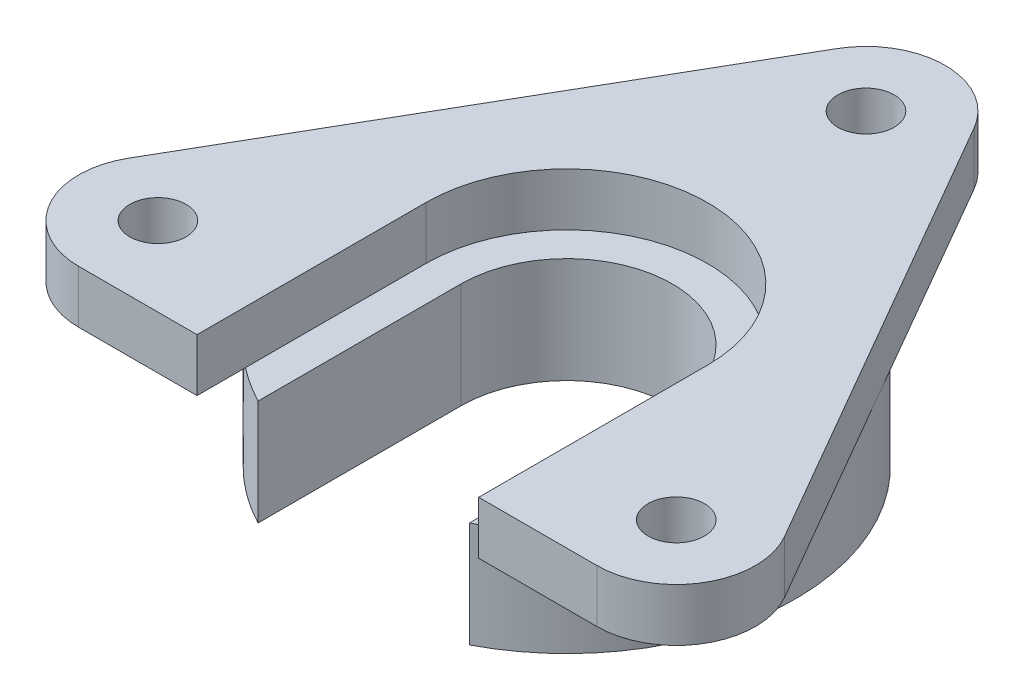
ISO-10303-21;
HEADER;
FILE_DESCRIPTION(('STEP AP214'),'2;1');
FILE_NAME('part.step','',(''),(''),'','','');
FILE_SCHEMA(('AUTOMOTIVE_DESIGN { 1 0 10303 214 1 1 1 1 }'));
ENDSEC;
DATA;
#1=APPLICATION_CONTEXT('core data for automotive mechanical design processes');
#2=APPLICATION_PROTOCOL_DEFINITION('international standard','automotive_design',2000,#1);
#3=PRODUCT_CONTEXT('',#1,'mechanical');
#4=PRODUCT('Part','Part','',(#3));
#5=PRODUCT_RELATED_PRODUCT_CATEGORY('part','',(#4));
#6=PRODUCT_DEFINITION_FORMATION('','',#4);
#7=PRODUCT_DEFINITION_CONTEXT('part definition',#1,'design');
#8=PRODUCT_DEFINITION('design','',#6,#7);
#9=PRODUCT_DEFINITION_SHAPE('','',#8);
#10=(LENGTH_UNIT() NAMED_UNIT(*) SI_UNIT(.MILLI.,.METRE.));
#11=(NAMED_UNIT(*) PLANE_ANGLE_UNIT() SI_UNIT($,.RADIAN.));
#12=(NAMED_UNIT(*) SI_UNIT($,.STERADIAN.) SOLID_ANGLE_UNIT());
#13=UNCERTAINTY_MEASURE_WITH_UNIT(LENGTH_MEASURE(1.E-05),#10,'distance_accuracy_value','');
#14=(GEOMETRIC_REPRESENTATION_CONTEXT(3) GLOBAL_UNCERTAINTY_ASSIGNED_CONTEXT((#13)) GLOBAL_UNIT_ASSIGNED_CONTEXT((#10,
#11,#12)) REPRESENTATION_CONTEXT('',''));
#15=CARTESIAN_POINT('',(0.,0.,0.));
#16=DIRECTION('',(0.,0.,1.));
#17=DIRECTION('',(1.,0.,0.));
#18=AXIS2_PLACEMENT_3D('',#15,#16,#17);
#19=CARTESIAN_POINT('',(0.,-30.,0.));
#20=DIRECTION('',(0.,1.,0.));
#21=DIRECTION('',(0.,0.,1.));
#22=AXIS2_PLACEMENT_3D('',#19,#20,#21);
#23=PLANE('',#22);
#24=DIRECTION('',(0.,0.,-1.));
#25=VECTOR('',#24,1.);
#26=CARTESIAN_POINT('',(8.,-30.,13.));
#27=LINE('',#26,#25);
#28=CARTESIAN_POINT('',(8.,-30.,10.2469507659596));
#29=VERTEX_POINT('',#28);
#30=CARTESIAN_POINT('',(8.,-30.,0.));
#31=VERTEX_POINT('',#30);
#32=EDGE_CURVE('E260',#29,#31,#27,.T.);
#33=ORIENTED_EDGE('',*,*,#32,.T.);
#34=CARTESIAN_POINT('',(0.,-30.,0.));
#35=DIRECTION('',(0.,1.,0.));
#36=DIRECTION('',(0.,0.,1.));
#37=AXIS2_PLACEMENT_3D('',#34,#35,#36);
#38=CIRCLE('',#37,8.);
#39=CARTESIAN_POINT('',(-8.,-30.,0.));
#40=VERTEX_POINT('',#39);
#41=EDGE_CURVE('E277',#31,#40,#38,.T.);
#42=ORIENTED_EDGE('',*,*,#41,.T.);
#43=DIRECTION('',(0.,0.,-1.));
#44=VECTOR('',#43,1.);
#45=CARTESIAN_POINT('',(-8.,-30.,13.));
#46=LINE('',#45,#44);
#47=CARTESIAN_POINT('',(-8.,-30.,10.2469507659596));
#48=VERTEX_POINT('',#47);
#49=EDGE_CURVE('E54',#48,#40,#46,.T.);
#50=ORIENTED_EDGE('',*,*,#49,.F.);
#51=CARTESIAN_POINT('',(0.,-30.,0.));
#52=DIRECTION('',(0.,1.,0.));
#53=DIRECTION('',(0.,0.,1.));
#54=AXIS2_PLACEMENT_3D('',#51,#52,#53);
#55=CIRCLE('',#54,13.);
#56=CARTESIAN_POINT('',(-6.,-30.,11.5325625946708));
#57=VERTEX_POINT('',#56);
#58=EDGE_CURVE('E245',#57,#48,#55,.F.);
#59=ORIENTED_EDGE('',*,*,#58,.F.);
#60=DIRECTION('',(0.,0.,-1.));
#61=VECTOR('',#60,1.);
#62=CARTESIAN_POINT('',(-6.,-30.,13.));
#63=LINE('',#62,#61);
#64=CARTESIAN_POINT('',(-6.,-30.,0.));
#65=VERTEX_POINT('',#64);
#66=EDGE_CURVE('E243',#57,#65,#63,.T.);
#67=ORIENTED_EDGE('',*,*,#66,.T.);
#68=CARTESIAN_POINT('',(0.,-30.,0.));
#69=DIRECTION('',(0.,1.,0.));
#70=DIRECTION('',(0.,0.,1.));
#71=AXIS2_PLACEMENT_3D('',#68,#69,#70);
#72=CIRCLE('',#71,6.);
#73=CARTESIAN_POINT('',(6.,-30.,0.));
#74=VERTEX_POINT('',#73);
#75=EDGE_CURVE('E224',#74,#65,#72,.T.);
#76=ORIENTED_EDGE('',*,*,#75,.F.);
#77=DIRECTION('',(0.,0.,-1.));
#78=VECTOR('',#77,1.);
#79=CARTESIAN_POINT('',(6.,-30.,13.));
#80=LINE('',#79,#78);
#81=CARTESIAN_POINT('',(6.,-30.,11.5325625946708));
#82=VERTEX_POINT('',#81);
#83=EDGE_CURVE('E240',#82,#74,#80,.T.);
#84=ORIENTED_EDGE('',*,*,#83,.F.);
#85=CARTESIAN_POINT('',(0.,-30.,0.));
#86=DIRECTION('',(0.,1.,0.));
#87=DIRECTION('',(0.,0.,1.));
#88=AXIS2_PLACEMENT_3D('',#85,#86,#87);
#89=CIRCLE('',#88,13.);
#90=EDGE_CURVE('E161',#29,#82,#89,.F.);
#91=ORIENTED_EDGE('',*,*,#90,.F.);
#92=EDGE_LOOP('',(#33,#42,#50,#59,#67,#76,#84,#91));
#93=FACE_BOUND('',#92,.T.);
#94=ADVANCED_FACE('F39',(#93),#23,.T.);
#95=CARTESIAN_POINT('',(0.,-36.,0.));
#96=DIRECTION('',(0.,1.,0.));
#97=DIRECTION('',(0.,0.,1.));
#98=AXIS2_PLACEMENT_3D('',#95,#96,#97);
#99=CYLINDRICAL_SURFACE('',#98,13.);
#100=CARTESIAN_POINT('',(0.,-36.,0.));
#101=DIRECTION('',(0.,1.,0.));
#102=DIRECTION('',(0.,0.,1.));
#103=AXIS2_PLACEMENT_3D('',#100,#101,#102);
#104=CIRCLE('',#103,13.);
#105=CARTESIAN_POINT('',(6.,-36.,11.5325625946708));
#106=VERTEX_POINT('',#105);
#107=CARTESIAN_POINT('',(-6.,-36.,11.5325625946708));
#108=VERTEX_POINT('',#107);
#109=EDGE_CURVE('E11',#106,#108,#104,.T.);
#110=ORIENTED_EDGE('',*,*,#109,.T.);
#111=DIRECTION('',(0.,1.,0.));
#112=VECTOR('',#111,1.);
#113=CARTESIAN_POINT('',(-6.,-36.,11.5325625946708));
#114=LINE('',#113,#112);
#115=EDGE_CURVE('E270',#108,#57,#114,.T.);
#116=ORIENTED_EDGE('',*,*,#115,.T.);
#117=ORIENTED_EDGE('',*,*,#58,.T.);
#118=CARTESIAN_POINT('',(0.,-30.,0.));
#119=DIRECTION('',(0.,1.,0.));
#120=DIRECTION('',(0.,0.,1.));
#121=AXIS2_PLACEMENT_3D('',#118,#119,#120);
#122=CIRCLE('',#121,13.);
#123=CARTESIAN_POINT('',(-11.2583302491977,-30.,-6.5));
#124=VERTEX_POINT('',#123);
#125=EDGE_CURVE('E228',#124,#48,#122,.T.);
#126=ORIENTED_EDGE('',*,*,#125,.F.);
#127=CARTESIAN_POINT('',(11.2583302491977,-30.,-6.5));
#128=VERTEX_POINT('',#127);
#129=EDGE_CURVE('E557',#128,#124,#122,.T.);
#130=ORIENTED_EDGE('',*,*,#129,.F.);
#131=EDGE_CURVE('E43',#29,#128,#122,.T.);
#132=ORIENTED_EDGE('',*,*,#131,.F.);
#133=ORIENTED_EDGE('',*,*,#90,.T.);
#134=DIRECTION('',(0.,1.,0.));
#135=VECTOR('',#134,1.);
#136=CARTESIAN_POINT('',(6.,-36.,11.5325625946708));
#137=LINE('',#136,#135);
#138=EDGE_CURVE('E274',#82,#106,#137,.F.);
#139=ORIENTED_EDGE('',*,*,#138,.T.);
#140=EDGE_LOOP('',(#110,#116,#117,#126,#130,#132,#133,#139));
#141=FACE_BOUND('',#140,.T.);
#142=ADVANCED_FACE('F41',(#141),#99,.T.);
#143=CARTESIAN_POINT('',(0.,-36.,0.));
#144=DIRECTION('',(0.,1.,0.));
#145=DIRECTION('',(0.,0.,1.));
#146=AXIS2_PLACEMENT_3D('',#143,#144,#145);
#147=PLANE('',#146);
#148=DIRECTION('',(0.,0.,-1.));
#149=VECTOR('',#148,1.);
#150=CARTESIAN_POINT('',(-6.,-36.,0.));
#151=LINE('',#150,#149);
#152=CARTESIAN_POINT('',(-6.,-36.,0.));
#153=VERTEX_POINT('',#152);
#154=EDGE_CURVE('E251',#108,#153,#151,.T.);
#155=ORIENTED_EDGE('',*,*,#154,.F.);
#156=ORIENTED_EDGE('',*,*,#109,.F.);
#157=DIRECTION('',(0.,0.,1.));
#158=VECTOR('',#157,1.);
#159=CARTESIAN_POINT('',(6.,-36.,0.));
#160=LINE('',#159,#158);
#161=CARTESIAN_POINT('',(6.,-36.,0.));
#162=VERTEX_POINT('',#161);
#163=EDGE_CURVE('E272',#162,#106,#160,.T.);
#164=ORIENTED_EDGE('',*,*,#163,.F.);
#165=CARTESIAN_POINT('',(0.,-36.,0.));
#166=DIRECTION('',(0.,1.,0.));
#167=DIRECTION('',(0.,0.,1.));
#168=AXIS2_PLACEMENT_3D('',#165,#166,#167);
#169=CIRCLE('',#168,6.);
#170=EDGE_CURVE('E225',#162,#153,#169,.T.);
#171=ORIENTED_EDGE('',*,*,#170,.T.);
#172=EDGE_LOOP('',(#155,#156,#164,#171));
#173=FACE_BOUND('',#172,.T.);
#174=ADVANCED_FACE('F300',(#173),#147,.F.);
#175=CARTESIAN_POINT('',(0.,-36.,0.));
#176=DIRECTION('',(0.,1.,0.));
#177=DIRECTION('',(0.,0.,1.));
#178=AXIS2_PLACEMENT_3D('',#175,#176,#177);
#179=CYLINDRICAL_SURFACE('',#178,6.);
#180=DIRECTION('',(0.,1.,0.));
#181=VECTOR('',#180,1.);
#182=CARTESIAN_POINT('',(6.,-36.2763210858077,0.));
#183=LINE('',#182,#181);
#184=EDGE_CURVE('E238',#162,#74,#183,.T.);
#185=ORIENTED_EDGE('',*,*,#184,.T.);
#186=ORIENTED_EDGE('',*,*,#75,.T.);
#187=DIRECTION('',(0.,-1.,0.));
#188=VECTOR('',#187,1.);
#189=CARTESIAN_POINT('',(-6.,-30.,0.));
#190=LINE('',#189,#188);
#191=EDGE_CURVE('E237',#65,#153,#190,.T.);
#192=ORIENTED_EDGE('',*,*,#191,.T.);
#193=ORIENTED_EDGE('',*,*,#170,.F.);
#194=EDGE_LOOP('',(#185,#186,#192,#193));
#195=FACE_BOUND('',#194,.T.);
#196=ADVANCED_FACE('F234',(#195),#179,.F.);
#197=CARTESIAN_POINT('',(0.,-30.,-17.));
#198=DIRECTION('',(0.,1.,0.));
#199=DIRECTION('',(0.,0.,1.));
#200=AXIS2_PLACEMENT_3D('',#197,#198,#199);
#201=PLANE('',#200);
#202=CARTESIAN_POINT('',(14.7224318643355,-30.,8.5));
#203=DIRECTION('',(0.,1.,0.));
#204=DIRECTION('',(0.,0.,1.));
#205=AXIS2_PLACEMENT_3D('',#202,#203,#204);
#206=CIRCLE('',#205,1.6);
#207=CARTESIAN_POINT('',(14.7224318643355,-30.,10.1));
#208=VERTEX_POINT('',#207);
#209=EDGE_CURVE('E386',#208,#208,#206,.T.);
#210=ORIENTED_EDGE('',*,*,#209,.T.);
#211=EDGE_LOOP('',(#210));
#212=FACE_BOUND('',#211,.T.);
#213=CARTESIAN_POINT('',(8.,-30.,13.));
#214=VERTEX_POINT('',#213);
#215=EDGE_CURVE('E261',#214,#29,#27,.T.);
#216=ORIENTED_EDGE('',*,*,#215,.T.);
#217=ORIENTED_EDGE('',*,*,#131,.T.);
#218=DIRECTION('',(-0.5,0.,-0.866025403784438));
#219=VECTOR('',#218,1.);
#220=CARTESIAN_POINT('',(18.6195461813654,-30.,6.25));
#221=LINE('',#220,#219);
#222=CARTESIAN_POINT('',(18.6195461813654,-30.,6.25));
#223=VERTEX_POINT('',#222);
#224=EDGE_CURVE('E204',#223,#128,#221,.T.);
#225=ORIENTED_EDGE('',*,*,#224,.F.);
#226=CARTESIAN_POINT('',(14.7224318643355,-30.,8.5));
#227=DIRECTION('',(0.,1.,0.));
#228=DIRECTION('',(0.,0.,1.));
#229=AXIS2_PLACEMENT_3D('',#226,#227,#228);
#230=CIRCLE('',#229,4.5);
#231=CARTESIAN_POINT('',(14.7224318643355,-30.,13.));
#232=VERTEX_POINT('',#231);
#233=EDGE_CURVE('E201',#232,#223,#230,.T.);
#234=ORIENTED_EDGE('',*,*,#233,.F.);
#235=DIRECTION('',(1.,0.,0.));
#236=VECTOR('',#235,1.);
#237=CARTESIAN_POINT('',(-14.7224318643354,-30.,13.));
#238=LINE('',#237,#236);
#239=EDGE_CURVE('E199',#214,#232,#238,.T.);
#240=ORIENTED_EDGE('',*,*,#239,.F.);
#241=EDGE_LOOP('',(#216,#217,#225,#234,#240));
#242=FACE_BOUND('',#241,.T.);
#243=ADVANCED_FACE('F311',(#212,#242),#201,.F.);
#244=CARTESIAN_POINT('',(-14.7224318643354,-30.,8.5));
#245=DIRECTION('',(0.,1.,0.));
#246=DIRECTION('',(0.,0.,1.));
#247=AXIS2_PLACEMENT_3D('',#244,#245,#246);
#248=CIRCLE('',#247,1.6);
#249=CARTESIAN_POINT('',(-14.7224318643354,-30.,10.1));
#250=VERTEX_POINT('',#249);
#251=EDGE_CURVE('E380',#250,#250,#248,.T.);
#252=ORIENTED_EDGE('',*,*,#251,.T.);
#253=EDGE_LOOP('',(#252));
#254=FACE_BOUND('',#253,.T.);
#255=CARTESIAN_POINT('',(-8.,-30.,13.));
#256=VERTEX_POINT('',#255);
#257=EDGE_CURVE('E162',#256,#48,#46,.T.);
#258=ORIENTED_EDGE('',*,*,#257,.F.);
#259=CARTESIAN_POINT('',(-14.7224318643354,-30.,13.));
#260=VERTEX_POINT('',#259);
#261=EDGE_CURVE('E171',#260,#256,#238,.T.);
#262=ORIENTED_EDGE('',*,*,#261,.F.);
#263=CARTESIAN_POINT('',(-14.7224318643354,-30.,8.5));
#264=DIRECTION('',(0.,1.,0.));
#265=DIRECTION('',(0.,0.,1.));
#266=AXIS2_PLACEMENT_3D('',#263,#264,#265);
#267=CIRCLE('',#266,4.50000000000001);
#268=CARTESIAN_POINT('',(-18.6195461813654,-30.,6.24999999999999));
#269=VERTEX_POINT('',#268);
#270=EDGE_CURVE('E197',#269,#260,#267,.T.);
#271=ORIENTED_EDGE('',*,*,#270,.F.);
#272=DIRECTION('',(-0.5,0.,0.866025403784438));
#273=VECTOR('',#272,1.);
#274=CARTESIAN_POINT('',(-3.89711431702998,-30.,-19.25));
#275=LINE('',#274,#273);
#276=EDGE_CURVE('E192',#124,#269,#275,.T.);
#277=ORIENTED_EDGE('',*,*,#276,.F.);
#278=ORIENTED_EDGE('',*,*,#125,.T.);
#279=EDGE_LOOP('',(#258,#262,#271,#277,#278));
#280=FACE_BOUND('',#279,.T.);
#281=ADVANCED_FACE('F293',(#254,#280),#201,.F.);
#282=CARTESIAN_POINT('',(0.,-27.,-17.));
#283=DIRECTION('',(0.,1.,0.));
#284=DIRECTION('',(0.,0.,1.));
#285=AXIS2_PLACEMENT_3D('',#282,#283,#284);
#286=PLANE('',#285);
#287=CARTESIAN_POINT('',(0.,-27.,-17.));
#288=DIRECTION('',(0.,1.,0.));
#289=DIRECTION('',(0.,0.,1.));
#290=AXIS2_PLACEMENT_3D('',#287,#288,#289);
#291=CIRCLE('',#290,1.6);
#292=CARTESIAN_POINT('',(0.,-27.,-15.4));
#293=VERTEX_POINT('',#292);
#294=EDGE_CURVE('E372',#293,#293,#291,.T.);
#295=ORIENTED_EDGE('',*,*,#294,.F.);
#296=EDGE_LOOP('',(#295));
#297=FACE_BOUND('',#296,.T.);
#298=CARTESIAN_POINT('',(14.7224318643355,-27.,8.5));
#299=DIRECTION('',(0.,1.,0.));
#300=DIRECTION('',(0.,0.,1.));
#301=AXIS2_PLACEMENT_3D('',#298,#299,#300);
#302=CIRCLE('',#301,1.6);
#303=CARTESIAN_POINT('',(14.7224318643355,-27.,10.1));
#304=VERTEX_POINT('',#303);
#305=EDGE_CURVE('E376',#304,#304,#302,.T.);
#306=ORIENTED_EDGE('',*,*,#305,.F.);
#307=EDGE_LOOP('',(#306));
#308=FACE_BOUND('',#307,.T.);
#309=CARTESIAN_POINT('',(-14.7224318643354,-27.,8.5));
#310=DIRECTION('',(0.,1.,0.));
#311=DIRECTION('',(0.,0.,1.));
#312=AXIS2_PLACEMENT_3D('',#309,#310,#311);
#313=CIRCLE('',#312,1.6);
#314=CARTESIAN_POINT('',(-14.7224318643354,-27.,10.1));
#315=VERTEX_POINT('',#314);
#316=EDGE_CURVE('E254',#315,#315,#313,.T.);
#317=ORIENTED_EDGE('',*,*,#316,.F.);
#318=EDGE_LOOP('',(#317));
#319=FACE_BOUND('',#318,.T.);
#320=DIRECTION('',(1.,0.,0.));
#321=VECTOR('',#320,1.);
#322=CARTESIAN_POINT('',(-14.7224318643354,-27.,13.));
#323=LINE('',#322,#321);
#324=CARTESIAN_POINT('',(-14.7224318643354,-27.,13.));
#325=VERTEX_POINT('',#324);
#326=CARTESIAN_POINT('',(-8.,-27.,13.));
#327=VERTEX_POINT('',#326);
#328=EDGE_CURVE('E169',#325,#327,#323,.T.);
#329=ORIENTED_EDGE('',*,*,#328,.T.);
#330=DIRECTION('',(0.,0.,-1.));
#331=VECTOR('',#330,1.);
#332=CARTESIAN_POINT('',(-8.,-27.,13.));
#333=LINE('',#332,#331);
#334=CARTESIAN_POINT('',(-8.,-27.,0.));
#335=VERTEX_POINT('',#334);
#336=EDGE_CURVE('E151',#327,#335,#333,.T.);
#337=ORIENTED_EDGE('',*,*,#336,.T.);
#338=CARTESIAN_POINT('',(0.,-27.,0.));
#339=DIRECTION('',(0.,1.,0.));
#340=DIRECTION('',(0.,0.,1.));
#341=AXIS2_PLACEMENT_3D('',#338,#339,#340);
#342=CIRCLE('',#341,8.);
#343=CARTESIAN_POINT('',(8.,-27.,0.));
#344=VERTEX_POINT('',#343);
#345=EDGE_CURVE('E193',#344,#335,#342,.T.);
#346=ORIENTED_EDGE('',*,*,#345,.F.);
#347=DIRECTION('',(0.,0.,-1.));
#348=VECTOR('',#347,1.);
#349=CARTESIAN_POINT('',(8.,-27.,13.));
#350=LINE('',#349,#348);
#351=CARTESIAN_POINT('',(8.,-27.,13.));
#352=VERTEX_POINT('',#351);
#353=EDGE_CURVE('E62',#352,#344,#350,.T.);
#354=ORIENTED_EDGE('',*,*,#353,.F.);
#355=CARTESIAN_POINT('',(14.7224318643355,-27.,13.));
#356=VERTEX_POINT('',#355);
#357=EDGE_CURVE('E180',#352,#356,#323,.T.);
#358=ORIENTED_EDGE('',*,*,#357,.T.);
#359=CARTESIAN_POINT('',(14.7224318643355,-27.,8.5));
#360=DIRECTION('',(0.,1.,0.));
#361=DIRECTION('',(0.,0.,1.));
#362=AXIS2_PLACEMENT_3D('',#359,#360,#361);
#363=CIRCLE('',#362,4.5);
#364=CARTESIAN_POINT('',(18.6195461813654,-27.,6.25));
#365=VERTEX_POINT('',#364);
#366=EDGE_CURVE('E179',#356,#365,#363,.T.);
#367=ORIENTED_EDGE('',*,*,#366,.T.);
#368=DIRECTION('',(-0.5,0.,-0.866025403784438));
#369=VECTOR('',#368,1.);
#370=CARTESIAN_POINT('',(18.6195461813654,-27.,6.25));
#371=LINE('',#370,#369);
#372=CARTESIAN_POINT('',(3.89711431702997,-27.,-19.25));
#373=VERTEX_POINT('',#372);
#374=EDGE_CURVE('E182',#365,#373,#371,.T.);
#375=ORIENTED_EDGE('',*,*,#374,.T.);
#376=CARTESIAN_POINT('',(0.,-27.,-17.));
#377=DIRECTION('',(0.,1.,0.));
#378=DIRECTION('',(0.,0.,1.));
#379=AXIS2_PLACEMENT_3D('',#376,#377,#378);
#380=CIRCLE('',#379,4.5);
#381=CARTESIAN_POINT('',(-3.89711431702998,-27.,-19.25));
#382=VERTEX_POINT('',#381);
#383=EDGE_CURVE('E207',#373,#382,#380,.T.);
#384=ORIENTED_EDGE('',*,*,#383,.T.);
#385=DIRECTION('',(-0.5,0.,0.866025403784438));
#386=VECTOR('',#385,1.);
#387=CARTESIAN_POINT('',(-3.89711431702998,-27.,-19.25));
#388=LINE('',#387,#386);
#389=CARTESIAN_POINT('',(-18.6195461813654,-27.,6.24999999999999));
#390=VERTEX_POINT('',#389);
#391=EDGE_CURVE('E282',#382,#390,#388,.T.);
#392=ORIENTED_EDGE('',*,*,#391,.T.);
#393=CARTESIAN_POINT('',(-14.7224318643354,-27.,8.5));
#394=DIRECTION('',(0.,1.,0.));
#395=DIRECTION('',(0.,0.,1.));
#396=AXIS2_PLACEMENT_3D('',#393,#394,#395);
#397=CIRCLE('',#396,4.50000000000001);
#398=EDGE_CURVE('E177',#390,#325,#397,.T.);
#399=ORIENTED_EDGE('',*,*,#398,.T.);
#400=EDGE_LOOP('',(#329,#337,#346,#354,#358,#367,#375,#384,#392,#399));
#401=FACE_BOUND('',#400,.T.);
#402=ADVANCED_FACE('F175',(#297,#308,#319,#401),#286,.T.);
#403=CARTESIAN_POINT('',(-14.7224318643354,-27.,13.));
#404=DIRECTION('',(0.,0.,-1.));
#405=DIRECTION('',(-1.,0.,0.));
#406=AXIS2_PLACEMENT_3D('',#403,#404,#405);
#407=PLANE('',#406);
#408=DIRECTION('',(0.,-1.,0.));
#409=VECTOR('',#408,1.);
#410=CARTESIAN_POINT('',(-8.,-27.,13.));
#411=LINE('',#410,#409);
#412=EDGE_CURVE('E154',#327,#256,#411,.T.);
#413=ORIENTED_EDGE('',*,*,#412,.F.);
#414=ORIENTED_EDGE('',*,*,#328,.F.);
#415=DIRECTION('',(0.,-1.,0.));
#416=VECTOR('',#415,1.);
#417=CARTESIAN_POINT('',(-14.7224318643354,-27.,13.));
#418=LINE('',#417,#416);
#419=EDGE_CURVE('E216',#325,#260,#418,.T.);
#420=ORIENTED_EDGE('',*,*,#419,.T.);
#421=ORIENTED_EDGE('',*,*,#261,.T.);
#422=EDGE_LOOP('',(#413,#414,#420,#421));
#423=FACE_BOUND('',#422,.T.);
#424=ADVANCED_FACE('F167',(#423),#407,.F.);
#425=DIRECTION('',(0.,1.,0.));
#426=VECTOR('',#425,1.);
#427=CARTESIAN_POINT('',(8.,-30.,13.));
#428=LINE('',#427,#426);
#429=EDGE_CURVE('E172',#214,#352,#428,.T.);
#430=ORIENTED_EDGE('',*,*,#429,.F.);
#431=ORIENTED_EDGE('',*,*,#239,.T.);
#432=DIRECTION('',(0.,-1.,0.));
#433=VECTOR('',#432,1.);
#434=CARTESIAN_POINT('',(14.7224318643355,-27.,13.));
#435=LINE('',#434,#433);
#436=EDGE_CURVE('E213',#356,#232,#435,.T.);
#437=ORIENTED_EDGE('',*,*,#436,.F.);
#438=ORIENTED_EDGE('',*,*,#357,.F.);
#439=EDGE_LOOP('',(#430,#431,#437,#438));
#440=FACE_BOUND('',#439,.T.);
#441=ADVANCED_FACE('F316',(#440),#407,.F.);
#442=CARTESIAN_POINT('',(0.,-27.,0.));
#443=DIRECTION('',(0.,-1.,0.));
#444=DIRECTION('',(0.,0.,-1.));
#445=AXIS2_PLACEMENT_3D('',#442,#443,#444);
#446=CYLINDRICAL_SURFACE('',#445,8.);
#447=ORIENTED_EDGE('',*,*,#345,.T.);
#448=DIRECTION('',(0.,-1.,0.));
#449=VECTOR('',#448,1.);
#450=CARTESIAN_POINT('',(-8.,-27.,0.));
#451=LINE('',#450,#449);
#452=EDGE_CURVE('E156',#335,#40,#451,.T.);
#453=ORIENTED_EDGE('',*,*,#452,.T.);
#454=ORIENTED_EDGE('',*,*,#41,.F.);
#455=DIRECTION('',(0.,1.,0.));
#456=VECTOR('',#455,1.);
#457=CARTESIAN_POINT('',(8.,-30.,0.));
#458=LINE('',#457,#456);
#459=EDGE_CURVE('E173',#31,#344,#458,.T.);
#460=ORIENTED_EDGE('',*,*,#459,.T.);
#461=EDGE_LOOP('',(#447,#453,#454,#460));
#462=FACE_BOUND('',#461,.T.);
#463=ADVANCED_FACE('F325',(#462),#446,.F.);
#464=CARTESIAN_POINT('',(0.,-30.,-17.));
#465=DIRECTION('',(0.,1.,0.));
#466=DIRECTION('',(0.,0.,1.));
#467=AXIS2_PLACEMENT_3D('',#464,#465,#466);
#468=CIRCLE('',#467,1.6);
#469=CARTESIAN_POINT('',(0.,-30.,-15.4));
#470=VERTEX_POINT('',#469);
#471=EDGE_CURVE('E390',#470,#470,#468,.T.);
#472=ORIENTED_EDGE('',*,*,#471,.T.);
#473=EDGE_LOOP('',(#472));
#474=FACE_BOUND('',#473,.T.);
#475=CARTESIAN_POINT('',(3.89711431702997,-30.,-19.25));
#476=VERTEX_POINT('',#475);
#477=EDGE_CURVE('E203',#128,#476,#221,.T.);
#478=ORIENTED_EDGE('',*,*,#477,.F.);
#479=ORIENTED_EDGE('',*,*,#129,.T.);
#480=CARTESIAN_POINT('',(-3.89711431702998,-30.,-19.25));
#481=VERTEX_POINT('',#480);
#482=EDGE_CURVE('E194',#481,#124,#275,.T.);
#483=ORIENTED_EDGE('',*,*,#482,.F.);
#484=CARTESIAN_POINT('',(0.,-30.,-17.));
#485=DIRECTION('',(0.,1.,0.));
#486=DIRECTION('',(0.,0.,1.));
#487=AXIS2_PLACEMENT_3D('',#484,#485,#486);
#488=CIRCLE('',#487,4.5);
#489=EDGE_CURVE('E189',#476,#481,#488,.T.);
#490=ORIENTED_EDGE('',*,*,#489,.F.);
#491=EDGE_LOOP('',(#478,#479,#483,#490));
#492=FACE_BOUND('',#491,.T.);
#493=ADVANCED_FACE('F327',(#474,#492),#201,.F.);
#494=CARTESIAN_POINT('',(0.,-27.,-17.));
#495=DIRECTION('',(0.,-1.,0.));
#496=DIRECTION('',(0.,0.,-1.));
#497=AXIS2_PLACEMENT_3D('',#494,#495,#496);
#498=CYLINDRICAL_SURFACE('',#497,4.5);
#499=ORIENTED_EDGE('',*,*,#489,.T.);
#500=DIRECTION('',(0.,-1.,0.));
#501=VECTOR('',#500,1.);
#502=CARTESIAN_POINT('',(-3.89711431702998,-27.,-19.25));
#503=LINE('',#502,#501);
#504=EDGE_CURVE('E221',#382,#481,#503,.T.);
#505=ORIENTED_EDGE('',*,*,#504,.F.);
#506=ORIENTED_EDGE('',*,*,#383,.F.);
#507=DIRECTION('',(0.,-1.,0.));
#508=VECTOR('',#507,1.);
#509=CARTESIAN_POINT('',(3.89711431702997,-27.,-19.25));
#510=LINE('',#509,#508);
#511=EDGE_CURVE('E188',#373,#476,#510,.T.);
#512=ORIENTED_EDGE('',*,*,#511,.T.);
#513=EDGE_LOOP('',(#499,#505,#506,#512));
#514=FACE_BOUND('',#513,.T.);
#515=ADVANCED_FACE('F333',(#514),#498,.T.);
#516=CARTESIAN_POINT('',(-3.89711431702998,-27.,-19.25));
#517=DIRECTION('',(0.866025403784439,0.,0.5));
#518=DIRECTION('',(0.5,0.,-0.866025403784439));
#519=AXIS2_PLACEMENT_3D('',#516,#517,#518);
#520=PLANE('',#519);
#521=ORIENTED_EDGE('',*,*,#482,.T.);
#522=ORIENTED_EDGE('',*,*,#276,.T.);
#523=DIRECTION('',(0.,-1.,0.));
#524=VECTOR('',#523,1.);
#525=CARTESIAN_POINT('',(-18.6195461813654,-27.,6.24999999999999));
#526=LINE('',#525,#524);
#527=EDGE_CURVE('E218',#390,#269,#526,.T.);
#528=ORIENTED_EDGE('',*,*,#527,.F.);
#529=ORIENTED_EDGE('',*,*,#391,.F.);
#530=ORIENTED_EDGE('',*,*,#504,.T.);
#531=EDGE_LOOP('',(#521,#522,#528,#529,#530));
#532=FACE_BOUND('',#531,.T.);
#533=ADVANCED_FACE('F287',(#532),#520,.F.);
#534=CARTESIAN_POINT('',(-14.7224318643354,-27.,8.5));
#535=DIRECTION('',(0.,-1.,0.));
#536=DIRECTION('',(0.,0.,-1.));
#537=AXIS2_PLACEMENT_3D('',#534,#535,#536);
#538=CYLINDRICAL_SURFACE('',#537,4.50000000000001);
#539=ORIENTED_EDGE('',*,*,#270,.T.);
#540=ORIENTED_EDGE('',*,*,#419,.F.);
#541=ORIENTED_EDGE('',*,*,#398,.F.);
#542=ORIENTED_EDGE('',*,*,#527,.T.);
#543=EDGE_LOOP('',(#539,#540,#541,#542));
#544=FACE_BOUND('',#543,.T.);
#545=ADVANCED_FACE('F291',(#544),#538,.T.);
#546=CARTESIAN_POINT('',(14.7224318643355,-27.,8.5));
#547=DIRECTION('',(0.,-1.,0.));
#548=DIRECTION('',(0.,0.,-1.));
#549=AXIS2_PLACEMENT_3D('',#546,#547,#548);
#550=CYLINDRICAL_SURFACE('',#549,4.5);
#551=ORIENTED_EDGE('',*,*,#233,.T.);
#552=DIRECTION('',(0.,-1.,0.));
#553=VECTOR('',#552,1.);
#554=CARTESIAN_POINT('',(18.6195461813654,-27.,6.25));
#555=LINE('',#554,#553);
#556=EDGE_CURVE('E210',#365,#223,#555,.T.);
#557=ORIENTED_EDGE('',*,*,#556,.F.);
#558=ORIENTED_EDGE('',*,*,#366,.F.);
#559=ORIENTED_EDGE('',*,*,#436,.T.);
#560=EDGE_LOOP('',(#551,#557,#558,#559));
#561=FACE_BOUND('',#560,.T.);
#562=ADVANCED_FACE('F320',(#561),#550,.T.);
#563=CARTESIAN_POINT('',(18.6195461813654,-27.,6.25));
#564=DIRECTION('',(-0.866025403784439,0.,0.5));
#565=DIRECTION('',(0.5,0.,0.866025403784439));
#566=AXIS2_PLACEMENT_3D('',#563,#564,#565);
#567=PLANE('',#566);
#568=ORIENTED_EDGE('',*,*,#224,.T.);
#569=ORIENTED_EDGE('',*,*,#477,.T.);
#570=ORIENTED_EDGE('',*,*,#511,.F.);
#571=ORIENTED_EDGE('',*,*,#374,.F.);
#572=ORIENTED_EDGE('',*,*,#556,.T.);
#573=EDGE_LOOP('',(#568,#569,#570,#571,#572));
#574=FACE_BOUND('',#573,.T.);
#575=ADVANCED_FACE('F358',(#574),#567,.F.);
#576=CARTESIAN_POINT('',(8.,-30.,13.));
#577=DIRECTION('',(-1.,0.,0.));
#578=DIRECTION('',(0.,0.,1.));
#579=AXIS2_PLACEMENT_3D('',#576,#577,#578);
#580=PLANE('',#579);
#581=ORIENTED_EDGE('',*,*,#459,.F.);
#582=ORIENTED_EDGE('',*,*,#32,.F.);
#583=ORIENTED_EDGE('',*,*,#215,.F.);
#584=ORIENTED_EDGE('',*,*,#429,.T.);
#585=ORIENTED_EDGE('',*,*,#353,.T.);
#586=EDGE_LOOP('',(#581,#582,#583,#584,#585));
#587=FACE_BOUND('',#586,.T.);
#588=ADVANCED_FACE('F306',(#587),#580,.T.);
#589=CARTESIAN_POINT('',(6.,-36.2763210858077,13.));
#590=DIRECTION('',(-1.,0.,0.));
#591=DIRECTION('',(0.,0.,1.));
#592=AXIS2_PLACEMENT_3D('',#589,#590,#591);
#593=PLANE('',#592);
#594=ORIENTED_EDGE('',*,*,#138,.F.);
#595=ORIENTED_EDGE('',*,*,#83,.T.);
#596=ORIENTED_EDGE('',*,*,#184,.F.);
#597=ORIENTED_EDGE('',*,*,#163,.T.);
#598=EDGE_LOOP('',(#594,#595,#596,#597));
#599=FACE_BOUND('',#598,.T.);
#600=ADVANCED_FACE('F303',(#599),#593,.T.);
#601=CARTESIAN_POINT('',(-8.,-27.,13.));
#602=DIRECTION('',(1.,0.,0.));
#603=DIRECTION('',(0.,0.,-1.));
#604=AXIS2_PLACEMENT_3D('',#601,#602,#603);
#605=PLANE('',#604);
#606=ORIENTED_EDGE('',*,*,#452,.F.);
#607=ORIENTED_EDGE('',*,*,#336,.F.);
#608=ORIENTED_EDGE('',*,*,#412,.T.);
#609=ORIENTED_EDGE('',*,*,#257,.T.);
#610=ORIENTED_EDGE('',*,*,#49,.T.);
#611=EDGE_LOOP('',(#606,#607,#608,#609,#610));
#612=FACE_BOUND('',#611,.T.);
#613=ADVANCED_FACE('F153',(#612),#605,.T.);
#614=CARTESIAN_POINT('',(-6.,-30.,13.));
#615=DIRECTION('',(1.,0.,0.));
#616=DIRECTION('',(0.,0.,-1.));
#617=AXIS2_PLACEMENT_3D('',#614,#615,#616);
#618=PLANE('',#617);
#619=ORIENTED_EDGE('',*,*,#154,.T.);
#620=ORIENTED_EDGE('',*,*,#191,.F.);
#621=ORIENTED_EDGE('',*,*,#66,.F.);
#622=ORIENTED_EDGE('',*,*,#115,.F.);
#623=EDGE_LOOP('',(#619,#620,#621,#622));
#624=FACE_BOUND('',#623,.T.);
#625=ADVANCED_FACE('F249',(#624),#618,.T.);
#626=CARTESIAN_POINT('',(-14.7224318643354,-27.,8.5));
#627=DIRECTION('',(0.,1.,0.));
#628=DIRECTION('',(0.,0.,1.));
#629=AXIS2_PLACEMENT_3D('',#626,#627,#628);
#630=CYLINDRICAL_SURFACE('',#629,1.6);
#631=ORIENTED_EDGE('',*,*,#251,.F.);
#632=EDGE_LOOP('',(#631));
#633=FACE_BOUND('',#632,.T.);
#634=ORIENTED_EDGE('',*,*,#316,.T.);
#635=EDGE_LOOP('',(#634));
#636=FACE_BOUND('',#635,.T.);
#637=ADVANCED_FACE('F403',(#633,#636),#630,.F.);
#638=CARTESIAN_POINT('',(14.7224318643355,-27.,8.5));
#639=DIRECTION('',(0.,1.,0.));
#640=DIRECTION('',(0.,0.,1.));
#641=AXIS2_PLACEMENT_3D('',#638,#639,#640);
#642=CYLINDRICAL_SURFACE('',#641,1.6);
#643=ORIENTED_EDGE('',*,*,#209,.F.);
#644=EDGE_LOOP('',(#643));
#645=FACE_BOUND('',#644,.T.);
#646=ORIENTED_EDGE('',*,*,#305,.T.);
#647=EDGE_LOOP('',(#646));
#648=FACE_BOUND('',#647,.T.);
#649=ADVANCED_FACE('F398',(#645,#648),#642,.F.);
#650=CARTESIAN_POINT('',(0.,-27.,-17.));
#651=DIRECTION('',(0.,1.,0.));
#652=DIRECTION('',(0.,0.,1.));
#653=AXIS2_PLACEMENT_3D('',#650,#651,#652);
#654=CYLINDRICAL_SURFACE('',#653,1.6);
#655=ORIENTED_EDGE('',*,*,#471,.F.);
#656=EDGE_LOOP('',(#655));
#657=FACE_BOUND('',#656,.T.);
#658=ORIENTED_EDGE('',*,*,#294,.T.);
#659=EDGE_LOOP('',(#658));
#660=FACE_BOUND('',#659,.T.);
#661=ADVANCED_FACE('F395',(#657,#660),#654,.F.);
#662=CLOSED_SHELL('',(#94,#142,#174,#196,#243,#281,#402,#424,#441,#463,#493,#515,#533,#545,#562,
#575,#588,#600,#613,#625,#637,#649,#661));
#663=MANIFOLD_SOLID_BREP('B2',#662);
#664=ADVANCED_BREP_SHAPE_REPRESENTATION('',(#18,#663),#14);
#665=SHAPE_DEFINITION_REPRESENTATION(#9,#664);
ENDSEC;
END-ISO-10303-21;
